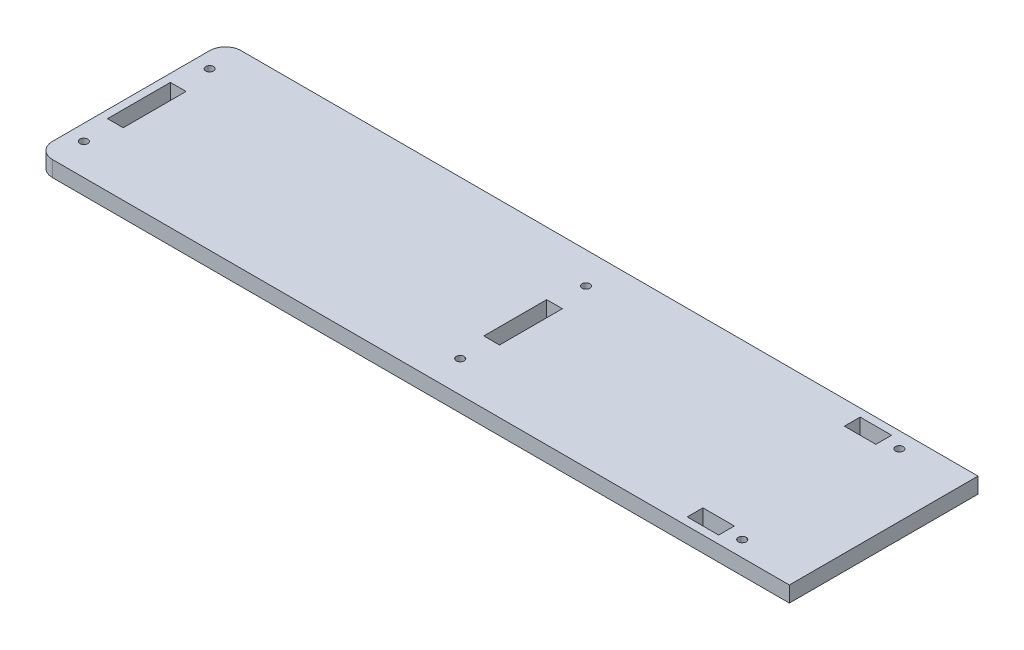
ISO-10303-21;
HEADER;
FILE_DESCRIPTION(('STEP AP214'),'2;1');
FILE_NAME('part.step','',(''),(''),'','','');
FILE_SCHEMA(('AUTOMOTIVE_DESIGN { 1 0 10303 214 1 1 1 1 }'));
ENDSEC;
DATA;
#1=APPLICATION_CONTEXT('core data for automotive mechanical design processes');
#2=APPLICATION_PROTOCOL_DEFINITION('international standard','automotive_design',2000,#1);
#3=PRODUCT_CONTEXT('',#1,'mechanical');
#4=PRODUCT('Part','Part','',(#3));
#5=PRODUCT_RELATED_PRODUCT_CATEGORY('part','',(#4));
#6=PRODUCT_DEFINITION_FORMATION('','',#4);
#7=PRODUCT_DEFINITION_CONTEXT('part definition',#1,'design');
#8=PRODUCT_DEFINITION('design','',#6,#7);
#9=PRODUCT_DEFINITION_SHAPE('','',#8);
#10=(LENGTH_UNIT() NAMED_UNIT(*) SI_UNIT(.MILLI.,.METRE.));
#11=(NAMED_UNIT(*) PLANE_ANGLE_UNIT() SI_UNIT($,.RADIAN.));
#12=(NAMED_UNIT(*) SI_UNIT($,.STERADIAN.) SOLID_ANGLE_UNIT());
#13=UNCERTAINTY_MEASURE_WITH_UNIT(LENGTH_MEASURE(1.E-05),#10,'distance_accuracy_value','');
#14=(GEOMETRIC_REPRESENTATION_CONTEXT(3) GLOBAL_UNCERTAINTY_ASSIGNED_CONTEXT((#13)) GLOBAL_UNIT_ASSIGNED_CONTEXT((#10,
#11,#12)) REPRESENTATION_CONTEXT('',''));
#15=CARTESIAN_POINT('',(0.,0.,0.));
#16=DIRECTION('',(0.,0.,1.));
#17=DIRECTION('',(1.,0.,0.));
#18=AXIS2_PLACEMENT_3D('',#15,#16,#17);
#19=CARTESIAN_POINT('',(-51.2350769381408,6.35,106.983409223297));
#20=DIRECTION('',(0.,1.,0.));
#21=DIRECTION('',(0.,0.,1.));
#22=AXIS2_PLACEMENT_3D('',#19,#20,#21);
#23=PLANE('',#22);
#24=DIRECTION('',(0.,0.,1.));
#25=VECTOR('',#24,1.);
#26=CARTESIAN_POINT('',(202.009341534766,6.35,103.808409223297));
#27=LINE('',#26,#25);
#28=CARTESIAN_POINT('',(202.009341534766,6.35,103.808409223297));
#29=VERTEX_POINT('',#28);
#30=CARTESIAN_POINT('',(202.009341534766,6.35,110.158409223297));
#31=VERTEX_POINT('',#30);
#32=EDGE_CURVE('E222',#29,#31,#27,.T.);
#33=ORIENTED_EDGE('',*,*,#32,.F.);
#34=DIRECTION('',(-1.,0.,0.));
#35=VECTOR('',#34,1.);
#36=CARTESIAN_POINT('',(214.709341534766,6.35,103.808409223297));
#37=LINE('',#36,#35);
#38=CARTESIAN_POINT('',(214.709341534766,6.35,103.808409223297));
#39=VERTEX_POINT('',#38);
#40=EDGE_CURVE('E220',#39,#29,#37,.T.);
#41=ORIENTED_EDGE('',*,*,#40,.F.);
#42=DIRECTION('',(0.,0.,-1.));
#43=VECTOR('',#42,1.);
#44=CARTESIAN_POINT('',(214.709341534766,6.35,110.158409223297));
#45=LINE('',#44,#43);
#46=CARTESIAN_POINT('',(214.709341534766,6.35,110.158409223297));
#47=VERTEX_POINT('',#46);
#48=EDGE_CURVE('E228',#47,#39,#45,.T.);
#49=ORIENTED_EDGE('',*,*,#48,.F.);
#50=DIRECTION('',(1.,0.,0.));
#51=VECTOR('',#50,1.);
#52=CARTESIAN_POINT('',(202.009341534766,6.35,110.158409223297));
#53=LINE('',#52,#51);
#54=EDGE_CURVE('E225',#31,#47,#53,.T.);
#55=ORIENTED_EDGE('',*,*,#54,.F.);
#56=EDGE_LOOP('',(#33,#41,#49,#55));
#57=FACE_BOUND('',#56,.T.);
#58=CARTESIAN_POINT('',(221.059341534766,6.35,106.983409223297));
#59=DIRECTION('',(0.,1.,0.));
#60=DIRECTION('',(0.,0.,1.));
#61=AXIS2_PLACEMENT_3D('',#58,#59,#60);
#62=CIRCLE('',#61,1.58749999999996);
#63=CARTESIAN_POINT('',(221.059341534766,6.35,108.570909223297));
#64=VERTEX_POINT('',#63);
#65=EDGE_CURVE('E249',#64,#64,#62,.T.);
#66=ORIENTED_EDGE('',*,*,#65,.F.);
#67=EDGE_LOOP('',(#66));
#68=FACE_BOUND('',#67,.T.);
#69=CARTESIAN_POINT('',(100.787132298313,6.35,100.633409223297));
#70=DIRECTION('',(0.,1.,0.));
#71=DIRECTION('',(0.,0.,1.));
#72=AXIS2_PLACEMENT_3D('',#69,#70,#71);
#73=CIRCLE('',#72,1.58749999999996);
#74=CARTESIAN_POINT('',(100.787132298313,6.35,102.220909223297));
#75=VERTEX_POINT('',#74);
#76=EDGE_CURVE('E261',#75,#75,#73,.T.);
#77=ORIENTED_EDGE('',*,*,#76,.F.);
#78=EDGE_LOOP('',(#77));
#79=FACE_BOUND('',#78,.T.);
#80=CARTESIAN_POINT('',(-51.2350769381408,6.35,100.633409223297));
#81=DIRECTION('',(0.,1.,0.));
#82=DIRECTION('',(0.,0.,1.));
#83=AXIS2_PLACEMENT_3D('',#80,#81,#82);
#84=CIRCLE('',#83,1.58750000000002);
#85=CARTESIAN_POINT('',(-51.2350769381408,6.35,102.220909223297));
#86=VERTEX_POINT('',#85);
#87=EDGE_CURVE('E302',#86,#86,#84,.T.);
#88=ORIENTED_EDGE('',*,*,#87,.F.);
#89=EDGE_LOOP('',(#88));
#90=FACE_BOUND('',#89,.T.);
#91=CARTESIAN_POINT('',(-51.2350769381408,6.35,106.983409223297));
#92=DIRECTION('',(0.,1.,0.));
#93=DIRECTION('',(0.,0.,1.));
#94=AXIS2_PLACEMENT_3D('',#91,#92,#93);
#95=CIRCLE('',#94,6.35000000000002);
#96=CARTESIAN_POINT('',(-57.5850769381407,6.35,106.983409223297));
#97=VERTEX_POINT('',#96);
#98=CARTESIAN_POINT('',(-51.2350769381408,6.35,113.333409223297));
#99=VERTEX_POINT('',#98);
#100=EDGE_CURVE('E337',#97,#99,#95,.T.);
#101=ORIENTED_EDGE('',*,*,#100,.T.);
#102=DIRECTION('',(1.,0.,0.));
#103=VECTOR('',#102,1.);
#104=CARTESIAN_POINT('',(-51.2350769381408,6.35,113.333409223297));
#105=LINE('',#104,#103);
#106=CARTESIAN_POINT('',(246.459341534766,6.35,113.333409223297));
#107=VERTEX_POINT('',#106);
#108=EDGE_CURVE('E340',#99,#107,#105,.T.);
#109=ORIENTED_EDGE('',*,*,#108,.T.);
#110=DIRECTION('',(0.,0.,-1.));
#111=VECTOR('',#110,1.);
#112=CARTESIAN_POINT('',(246.459341534766,6.35,37.133409223297));
#113=LINE('',#112,#111);
#114=CARTESIAN_POINT('',(246.459341534766,6.35,37.133409223297));
#115=VERTEX_POINT('',#114);
#116=EDGE_CURVE('E343',#107,#115,#113,.T.);
#117=ORIENTED_EDGE('',*,*,#116,.T.);
#118=DIRECTION('',(-1.,0.,0.));
#119=VECTOR('',#118,1.);
#120=CARTESIAN_POINT('',(-51.2350769381408,6.35,37.1334092232969));
#121=LINE('',#120,#119);
#122=CARTESIAN_POINT('',(-51.2350769381408,6.35,37.1334092232969));
#123=VERTEX_POINT('',#122);
#124=EDGE_CURVE('E345',#115,#123,#121,.T.);
#125=ORIENTED_EDGE('',*,*,#124,.T.);
#126=CARTESIAN_POINT('',(-51.2350769381408,6.35,43.483409223297));
#127=DIRECTION('',(0.,1.,0.));
#128=DIRECTION('',(0.,0.,1.));
#129=AXIS2_PLACEMENT_3D('',#126,#127,#128);
#130=CIRCLE('',#129,6.35000000000002);
#131=CARTESIAN_POINT('',(-57.5850769381408,6.35,43.483409223297));
#132=VERTEX_POINT('',#131);
#133=EDGE_CURVE('E347',#123,#132,#130,.T.);
#134=ORIENTED_EDGE('',*,*,#133,.T.);
#135=DIRECTION('',(0.,0.,1.));
#136=VECTOR('',#135,1.);
#137=CARTESIAN_POINT('',(-57.5850769381407,6.35,43.483409223297));
#138=LINE('',#137,#136);
#139=EDGE_CURVE('E349',#132,#97,#138,.T.);
#140=ORIENTED_EDGE('',*,*,#139,.T.);
#141=EDGE_LOOP('',(#101,#109,#117,#125,#134,#140));
#142=FACE_BOUND('',#141,.T.);
#143=DIRECTION('',(0.,0.,-1.));
#144=VECTOR('',#143,1.);
#145=CARTESIAN_POINT('',(-48.0600769381407,6.35,62.5334092232969));
#146=LINE('',#145,#144);
#147=CARTESIAN_POINT('',(-48.0600769381407,6.35,87.9334092232968));
#148=VERTEX_POINT('',#147);
#149=CARTESIAN_POINT('',(-48.0600769381407,6.35,62.5334092232969));
#150=VERTEX_POINT('',#149);
#151=EDGE_CURVE('E313',#148,#150,#146,.T.);
#152=ORIENTED_EDGE('',*,*,#151,.F.);
#153=DIRECTION('',(1.,0.,0.));
#154=VECTOR('',#153,1.);
#155=CARTESIAN_POINT('',(-48.0600769381407,6.35,87.9334092232968));
#156=LINE('',#155,#154);
#157=CARTESIAN_POINT('',(-54.4100769381406,6.35,87.9334092232968));
#158=VERTEX_POINT('',#157);
#159=EDGE_CURVE('E310',#158,#148,#156,.T.);
#160=ORIENTED_EDGE('',*,*,#159,.F.);
#161=DIRECTION('',(0.,0.,1.));
#162=VECTOR('',#161,1.);
#163=CARTESIAN_POINT('',(-54.4100769381406,6.35,87.9334092232968));
#164=LINE('',#163,#162);
#165=CARTESIAN_POINT('',(-54.4100769381408,6.35,62.5334092232969));
#166=VERTEX_POINT('',#165);
#167=EDGE_CURVE('E308',#166,#158,#164,.T.);
#168=ORIENTED_EDGE('',*,*,#167,.F.);
#169=DIRECTION('',(-1.,0.,0.));
#170=VECTOR('',#169,1.);
#171=CARTESIAN_POINT('',(-54.4100769381408,6.35,62.5334092232969));
#172=LINE('',#171,#170);
#173=EDGE_CURVE('E315',#150,#166,#172,.T.);
#174=ORIENTED_EDGE('',*,*,#173,.F.);
#175=EDGE_LOOP('',(#152,#160,#168,#174));
#176=FACE_BOUND('',#175,.T.);
#177=CARTESIAN_POINT('',(-51.2350769381408,6.35,49.8334092232968));
#178=DIRECTION('',(0.,1.,0.));
#179=DIRECTION('',(0.,0.,1.));
#180=AXIS2_PLACEMENT_3D('',#177,#178,#179);
#181=CIRCLE('',#180,1.58750000000002);
#182=CARTESIAN_POINT('',(-51.2350769381408,6.35,51.4209092232968));
#183=VERTEX_POINT('',#182);
#184=EDGE_CURVE('E296',#183,#183,#181,.T.);
#185=ORIENTED_EDGE('',*,*,#184,.F.);
#186=EDGE_LOOP('',(#185));
#187=FACE_BOUND('',#186,.T.);
#188=DIRECTION('',(0.,0.,-1.));
#189=VECTOR('',#188,1.);
#190=CARTESIAN_POINT('',(103.962132298313,6.35,62.533409223297));
#191=LINE('',#190,#189);
#192=CARTESIAN_POINT('',(103.962132298313,6.35,87.9334092232969));
#193=VERTEX_POINT('',#192);
#194=CARTESIAN_POINT('',(103.962132298313,6.35,62.533409223297));
#195=VERTEX_POINT('',#194);
#196=EDGE_CURVE('E272',#193,#195,#191,.T.);
#197=ORIENTED_EDGE('',*,*,#196,.F.);
#198=DIRECTION('',(1.,0.,0.));
#199=VECTOR('',#198,1.);
#200=CARTESIAN_POINT('',(103.962132298313,6.35,87.9334092232969));
#201=LINE('',#200,#199);
#202=CARTESIAN_POINT('',(97.6121322983129,6.35,87.9334092232969));
#203=VERTEX_POINT('',#202);
#204=EDGE_CURVE('E269',#203,#193,#201,.T.);
#205=ORIENTED_EDGE('',*,*,#204,.F.);
#206=DIRECTION('',(0.,0.,1.));
#207=VECTOR('',#206,1.);
#208=CARTESIAN_POINT('',(97.6121322983129,6.35,87.9334092232969));
#209=LINE('',#208,#207);
#210=CARTESIAN_POINT('',(97.6121322983128,6.35,62.533409223297));
#211=VERTEX_POINT('',#210);
#212=EDGE_CURVE('E267',#211,#203,#209,.T.);
#213=ORIENTED_EDGE('',*,*,#212,.F.);
#214=DIRECTION('',(-1.,0.,0.));
#215=VECTOR('',#214,1.);
#216=CARTESIAN_POINT('',(97.6121322983128,6.35,62.533409223297));
#217=LINE('',#216,#215);
#218=EDGE_CURVE('E274',#195,#211,#217,.T.);
#219=ORIENTED_EDGE('',*,*,#218,.F.);
#220=EDGE_LOOP('',(#197,#205,#213,#219));
#221=FACE_BOUND('',#220,.T.);
#222=CARTESIAN_POINT('',(100.787132298313,6.35,49.8334092232969));
#223=DIRECTION('',(0.,1.,0.));
#224=DIRECTION('',(0.,0.,1.));
#225=AXIS2_PLACEMENT_3D('',#222,#223,#224);
#226=CIRCLE('',#225,1.58749999999996);
#227=CARTESIAN_POINT('',(100.787132298313,6.35,51.4209092232969));
#228=VERTEX_POINT('',#227);
#229=EDGE_CURVE('E255',#228,#228,#226,.T.);
#230=ORIENTED_EDGE('',*,*,#229,.F.);
#231=EDGE_LOOP('',(#230));
#232=FACE_BOUND('',#231,.T.);
#233=CARTESIAN_POINT('',(221.059341534766,6.35,43.4834092232971));
#234=DIRECTION('',(0.,1.,0.));
#235=DIRECTION('',(0.,0.,1.));
#236=AXIS2_PLACEMENT_3D('',#233,#234,#235);
#237=CIRCLE('',#236,1.58749999999996);
#238=CARTESIAN_POINT('',(221.059341534766,6.35,45.070909223297));
#239=VERTEX_POINT('',#238);
#240=EDGE_CURVE('E214',#239,#239,#237,.T.);
#241=ORIENTED_EDGE('',*,*,#240,.F.);
#242=EDGE_LOOP('',(#241));
#243=FACE_BOUND('',#242,.T.);
#244=DIRECTION('',(-1.,0.,0.));
#245=VECTOR('',#244,1.);
#246=CARTESIAN_POINT('',(202.009341534766,6.35,40.308409223297));
#247=LINE('',#246,#245);
#248=CARTESIAN_POINT('',(214.709341534766,6.35,40.308409223297));
#249=VERTEX_POINT('',#248);
#250=CARTESIAN_POINT('',(202.009341534766,6.35,40.308409223297));
#251=VERTEX_POINT('',#250);
#252=EDGE_CURVE('E196',#249,#251,#247,.T.);
#253=ORIENTED_EDGE('',*,*,#252,.F.);
#254=DIRECTION('',(0.,0.,-1.));
#255=VECTOR('',#254,1.);
#256=CARTESIAN_POINT('',(214.709341534766,6.35,40.308409223297));
#257=LINE('',#256,#255);
#258=CARTESIAN_POINT('',(214.709341534766,6.35,46.658409223297));
#259=VERTEX_POINT('',#258);
#260=EDGE_CURVE('E183',#259,#249,#257,.T.);
#261=ORIENTED_EDGE('',*,*,#260,.F.);
#262=DIRECTION('',(1.,0.,0.));
#263=VECTOR('',#262,1.);
#264=CARTESIAN_POINT('',(214.709341534766,6.35,46.658409223297));
#265=LINE('',#264,#263);
#266=CARTESIAN_POINT('',(202.009341534766,6.35,46.658409223297));
#267=VERTEX_POINT('',#266);
#268=EDGE_CURVE('E178',#267,#259,#265,.T.);
#269=ORIENTED_EDGE('',*,*,#268,.F.);
#270=DIRECTION('',(0.,0.,1.));
#271=VECTOR('',#270,1.);
#272=CARTESIAN_POINT('',(202.009341534766,6.35,46.658409223297));
#273=LINE('',#272,#271);
#274=EDGE_CURVE('E198',#251,#267,#273,.T.);
#275=ORIENTED_EDGE('',*,*,#274,.F.);
#276=EDGE_LOOP('',(#253,#261,#269,#275));
#277=FACE_BOUND('',#276,.T.);
#278=ADVANCED_FACE('F32',(#57,#68,#79,#90,#142,#176,#187,#221,#232,#243,#277),#23,.T.);
#279=CARTESIAN_POINT('',(-51.2350769381408,0.,106.983409223297));
#280=DIRECTION('',(0.,1.,0.));
#281=DIRECTION('',(0.,0.,1.));
#282=AXIS2_PLACEMENT_3D('',#279,#280,#281);
#283=PLANE('',#282);
#284=CARTESIAN_POINT('',(221.059341534766,0.,43.4834092232971));
#285=DIRECTION('',(0.,1.,0.));
#286=DIRECTION('',(0.,0.,1.));
#287=AXIS2_PLACEMENT_3D('',#284,#285,#286);
#288=CIRCLE('',#287,1.58749999999996);
#289=CARTESIAN_POINT('',(221.059341534766,0.,45.070909223297));
#290=VERTEX_POINT('',#289);
#291=EDGE_CURVE('E192',#290,#290,#288,.T.);
#292=ORIENTED_EDGE('',*,*,#291,.T.);
#293=EDGE_LOOP('',(#292));
#294=FACE_BOUND('',#293,.T.);
#295=DIRECTION('',(-1.,0.,0.));
#296=VECTOR('',#295,1.);
#297=CARTESIAN_POINT('',(208.359341534766,0.,103.808409223297));
#298=LINE('',#297,#296);
#299=CARTESIAN_POINT('',(214.709341534766,0.,103.808409223297));
#300=VERTEX_POINT('',#299);
#301=CARTESIAN_POINT('',(202.009341534766,0.,103.808409223297));
#302=VERTEX_POINT('',#301);
#303=EDGE_CURVE('E217',#300,#302,#298,.T.);
#304=ORIENTED_EDGE('',*,*,#303,.T.);
#305=DIRECTION('',(0.,0.,1.));
#306=VECTOR('',#305,1.);
#307=CARTESIAN_POINT('',(202.009341534766,0.,103.808409223297));
#308=LINE('',#307,#306);
#309=CARTESIAN_POINT('',(202.009341534766,0.,110.158409223297));
#310=VERTEX_POINT('',#309);
#311=EDGE_CURVE('E233',#302,#310,#308,.T.);
#312=ORIENTED_EDGE('',*,*,#311,.T.);
#313=DIRECTION('',(1.,0.,0.));
#314=VECTOR('',#313,1.);
#315=CARTESIAN_POINT('',(202.009341534766,0.,110.158409223297));
#316=LINE('',#315,#314);
#317=CARTESIAN_POINT('',(214.709341534766,0.,110.158409223297));
#318=VERTEX_POINT('',#317);
#319=EDGE_CURVE('E236',#310,#318,#316,.T.);
#320=ORIENTED_EDGE('',*,*,#319,.T.);
#321=DIRECTION('',(0.,0.,-1.));
#322=VECTOR('',#321,1.);
#323=CARTESIAN_POINT('',(214.709341534766,0.,110.158409223297));
#324=LINE('',#323,#322);
#325=EDGE_CURVE('E223',#318,#300,#324,.T.);
#326=ORIENTED_EDGE('',*,*,#325,.T.);
#327=EDGE_LOOP('',(#304,#312,#320,#326));
#328=FACE_BOUND('',#327,.T.);
#329=CARTESIAN_POINT('',(-51.2350769381408,0.,49.8334092232968));
#330=DIRECTION('',(0.,1.,0.));
#331=DIRECTION('',(0.,0.,1.));
#332=AXIS2_PLACEMENT_3D('',#329,#330,#331);
#333=CIRCLE('',#332,1.58750000000002);
#334=CARTESIAN_POINT('',(-51.2350769381408,0.,51.4209092232968));
#335=VERTEX_POINT('',#334);
#336=EDGE_CURVE('E295',#335,#335,#333,.T.);
#337=ORIENTED_EDGE('',*,*,#336,.T.);
#338=EDGE_LOOP('',(#337));
#339=FACE_BOUND('',#338,.T.);
#340=CARTESIAN_POINT('',(-51.2350769381408,0.,100.633409223297));
#341=DIRECTION('',(0.,1.,0.));
#342=DIRECTION('',(0.,0.,1.));
#343=AXIS2_PLACEMENT_3D('',#340,#341,#342);
#344=CIRCLE('',#343,1.58750000000002);
#345=CARTESIAN_POINT('',(-51.2350769381408,0.,102.220909223297));
#346=VERTEX_POINT('',#345);
#347=EDGE_CURVE('E299',#346,#346,#344,.T.);
#348=ORIENTED_EDGE('',*,*,#347,.T.);
#349=EDGE_LOOP('',(#348));
#350=FACE_BOUND('',#349,.T.);
#351=DIRECTION('',(1.,0.,0.));
#352=VECTOR('',#351,1.);
#353=CARTESIAN_POINT('',(-48.0600769381407,0.,87.9334092232968));
#354=LINE('',#353,#352);
#355=CARTESIAN_POINT('',(-54.4100769381408,0.,87.9334092232968));
#356=VERTEX_POINT('',#355);
#357=CARTESIAN_POINT('',(-48.0600769381407,0.,87.9334092232968));
#358=VERTEX_POINT('',#357);
#359=EDGE_CURVE('E305',#356,#358,#354,.T.);
#360=ORIENTED_EDGE('',*,*,#359,.T.);
#361=DIRECTION('',(0.,0.,-1.));
#362=VECTOR('',#361,1.);
#363=CARTESIAN_POINT('',(-48.0600769381407,0.,62.5334092232969));
#364=LINE('',#363,#362);
#365=CARTESIAN_POINT('',(-48.0600769381407,0.,62.5334092232969));
#366=VERTEX_POINT('',#365);
#367=EDGE_CURVE('E321',#358,#366,#364,.T.);
#368=ORIENTED_EDGE('',*,*,#367,.T.);
#369=DIRECTION('',(-1.,0.,0.));
#370=VECTOR('',#369,1.);
#371=CARTESIAN_POINT('',(-54.4100769381408,0.,62.5334092232969));
#372=LINE('',#371,#370);
#373=CARTESIAN_POINT('',(-54.4100769381408,0.,62.5334092232969));
#374=VERTEX_POINT('',#373);
#375=EDGE_CURVE('E324',#366,#374,#372,.T.);
#376=ORIENTED_EDGE('',*,*,#375,.T.);
#377=DIRECTION('',(0.,0.,1.));
#378=VECTOR('',#377,1.);
#379=CARTESIAN_POINT('',(-54.4100769381408,0.,75.2334092232968));
#380=LINE('',#379,#378);
#381=EDGE_CURVE('E311',#374,#356,#380,.T.);
#382=ORIENTED_EDGE('',*,*,#381,.T.);
#383=EDGE_LOOP('',(#360,#368,#376,#382));
#384=FACE_BOUND('',#383,.T.);
#385=CARTESIAN_POINT('',(-51.2350769381408,0.,106.983409223297));
#386=DIRECTION('',(0.,1.,0.));
#387=DIRECTION('',(0.,0.,1.));
#388=AXIS2_PLACEMENT_3D('',#385,#386,#387);
#389=CIRCLE('',#388,6.35000000000002);
#390=CARTESIAN_POINT('',(-57.5850769381407,0.,106.983409223297));
#391=VERTEX_POINT('',#390);
#392=CARTESIAN_POINT('',(-51.2350769381408,0.,113.333409223297));
#393=VERTEX_POINT('',#392);
#394=EDGE_CURVE('E336',#391,#393,#389,.T.);
#395=ORIENTED_EDGE('',*,*,#394,.F.);
#396=DIRECTION('',(0.,0.,1.));
#397=VECTOR('',#396,1.);
#398=CARTESIAN_POINT('',(-57.5850769381407,0.,43.483409223297));
#399=LINE('',#398,#397);
#400=CARTESIAN_POINT('',(-57.5850769381408,0.,43.483409223297));
#401=VERTEX_POINT('',#400);
#402=EDGE_CURVE('E341',#401,#391,#399,.T.);
#403=ORIENTED_EDGE('',*,*,#402,.F.);
#404=CARTESIAN_POINT('',(-51.2350769381408,0.,43.483409223297));
#405=DIRECTION('',(0.,1.,0.));
#406=DIRECTION('',(0.,0.,1.));
#407=AXIS2_PLACEMENT_3D('',#404,#405,#406);
#408=CIRCLE('',#407,6.35000000000002);
#409=CARTESIAN_POINT('',(-51.2350769381408,0.,37.1334092232969));
#410=VERTEX_POINT('',#409);
#411=EDGE_CURVE('E360',#410,#401,#408,.T.);
#412=ORIENTED_EDGE('',*,*,#411,.F.);
#413=DIRECTION('',(-1.,0.,0.));
#414=VECTOR('',#413,1.);
#415=CARTESIAN_POINT('',(-51.2350769381408,0.,37.1334092232969));
#416=LINE('',#415,#414);
#417=CARTESIAN_POINT('',(246.459341534766,0.,37.133409223297));
#418=VERTEX_POINT('',#417);
#419=EDGE_CURVE('E358',#418,#410,#416,.T.);
#420=ORIENTED_EDGE('',*,*,#419,.F.);
#421=DIRECTION('',(0.,0.,-1.));
#422=VECTOR('',#421,1.);
#423=CARTESIAN_POINT('',(246.459341534766,0.,37.133409223297));
#424=LINE('',#423,#422);
#425=CARTESIAN_POINT('',(246.459341534766,0.,113.333409223297));
#426=VERTEX_POINT('',#425);
#427=EDGE_CURVE('E356',#426,#418,#424,.T.);
#428=ORIENTED_EDGE('',*,*,#427,.F.);
#429=DIRECTION('',(1.,0.,0.));
#430=VECTOR('',#429,1.);
#431=CARTESIAN_POINT('',(-51.2350769381408,0.,113.333409223297));
#432=LINE('',#431,#430);
#433=EDGE_CURVE('E354',#393,#426,#432,.T.);
#434=ORIENTED_EDGE('',*,*,#433,.F.);
#435=EDGE_LOOP('',(#395,#403,#412,#420,#428,#434));
#436=FACE_BOUND('',#435,.T.);
#437=DIRECTION('',(1.,0.,0.));
#438=VECTOR('',#437,1.);
#439=CARTESIAN_POINT('',(103.962132298313,0.,87.9334092232969));
#440=LINE('',#439,#438);
#441=CARTESIAN_POINT('',(97.6121322983128,0.,87.9334092232969));
#442=VERTEX_POINT('',#441);
#443=CARTESIAN_POINT('',(103.962132298313,0.,87.9334092232969));
#444=VERTEX_POINT('',#443);
#445=EDGE_CURVE('E264',#442,#444,#440,.T.);
#446=ORIENTED_EDGE('',*,*,#445,.T.);
#447=DIRECTION('',(0.,0.,-1.));
#448=VECTOR('',#447,1.);
#449=CARTESIAN_POINT('',(103.962132298313,0.,62.533409223297));
#450=LINE('',#449,#448);
#451=CARTESIAN_POINT('',(103.962132298313,0.,62.533409223297));
#452=VERTEX_POINT('',#451);
#453=EDGE_CURVE('E280',#444,#452,#450,.T.);
#454=ORIENTED_EDGE('',*,*,#453,.T.);
#455=DIRECTION('',(-1.,0.,0.));
#456=VECTOR('',#455,1.);
#457=CARTESIAN_POINT('',(97.6121322983128,0.,62.533409223297));
#458=LINE('',#457,#456);
#459=CARTESIAN_POINT('',(97.6121322983128,0.,62.533409223297));
#460=VERTEX_POINT('',#459);
#461=EDGE_CURVE('E283',#452,#460,#458,.T.);
#462=ORIENTED_EDGE('',*,*,#461,.T.);
#463=DIRECTION('',(0.,0.,1.));
#464=VECTOR('',#463,1.);
#465=CARTESIAN_POINT('',(97.6121322983128,0.,75.2334092232969));
#466=LINE('',#465,#464);
#467=EDGE_CURVE('E270',#460,#442,#466,.T.);
#468=ORIENTED_EDGE('',*,*,#467,.T.);
#469=EDGE_LOOP('',(#446,#454,#462,#468));
#470=FACE_BOUND('',#469,.T.);
#471=CARTESIAN_POINT('',(100.787132298313,0.,100.633409223297));
#472=DIRECTION('',(0.,1.,0.));
#473=DIRECTION('',(0.,0.,1.));
#474=AXIS2_PLACEMENT_3D('',#471,#472,#473);
#475=CIRCLE('',#474,1.58749999999996);
#476=CARTESIAN_POINT('',(100.787132298313,0.,102.220909223297));
#477=VERTEX_POINT('',#476);
#478=EDGE_CURVE('E258',#477,#477,#475,.T.);
#479=ORIENTED_EDGE('',*,*,#478,.T.);
#480=EDGE_LOOP('',(#479));
#481=FACE_BOUND('',#480,.T.);
#482=CARTESIAN_POINT('',(100.787132298313,0.,49.8334092232969));
#483=DIRECTION('',(0.,1.,0.));
#484=DIRECTION('',(0.,0.,1.));
#485=AXIS2_PLACEMENT_3D('',#482,#483,#484);
#486=CIRCLE('',#485,1.58749999999996);
#487=CARTESIAN_POINT('',(100.787132298313,0.,51.4209092232969));
#488=VERTEX_POINT('',#487);
#489=EDGE_CURVE('E252',#488,#488,#486,.T.);
#490=ORIENTED_EDGE('',*,*,#489,.T.);
#491=EDGE_LOOP('',(#490));
#492=FACE_BOUND('',#491,.T.);
#493=CARTESIAN_POINT('',(221.059341534766,0.,106.983409223297));
#494=DIRECTION('',(0.,1.,0.));
#495=DIRECTION('',(0.,0.,1.));
#496=AXIS2_PLACEMENT_3D('',#493,#494,#495);
#497=CIRCLE('',#496,1.58749999999996);
#498=CARTESIAN_POINT('',(221.059341534766,0.,108.570909223297));
#499=VERTEX_POINT('',#498);
#500=EDGE_CURVE('E248',#499,#499,#497,.T.);
#501=ORIENTED_EDGE('',*,*,#500,.T.);
#502=EDGE_LOOP('',(#501));
#503=FACE_BOUND('',#502,.T.);
#504=DIRECTION('',(0.,0.,-1.));
#505=VECTOR('',#504,1.);
#506=CARTESIAN_POINT('',(214.709341534766,0.,40.308409223297));
#507=LINE('',#506,#505);
#508=CARTESIAN_POINT('',(214.709341534766,0.,46.658409223297));
#509=VERTEX_POINT('',#508);
#510=CARTESIAN_POINT('',(214.709341534766,0.,40.308409223297));
#511=VERTEX_POINT('',#510);
#512=EDGE_CURVE('E190',#509,#511,#507,.T.);
#513=ORIENTED_EDGE('',*,*,#512,.T.);
#514=DIRECTION('',(-1.,0.,0.));
#515=VECTOR('',#514,1.);
#516=CARTESIAN_POINT('',(202.009341534766,0.,40.308409223297));
#517=LINE('',#516,#515);
#518=CARTESIAN_POINT('',(202.009341534766,0.,40.308409223297));
#519=VERTEX_POINT('',#518);
#520=EDGE_CURVE('E203',#511,#519,#517,.T.);
#521=ORIENTED_EDGE('',*,*,#520,.T.);
#522=DIRECTION('',(0.,0.,1.));
#523=VECTOR('',#522,1.);
#524=CARTESIAN_POINT('',(202.009341534766,0.,46.658409223297));
#525=LINE('',#524,#523);
#526=CARTESIAN_POINT('',(202.009341534766,0.,46.658409223297));
#527=VERTEX_POINT('',#526);
#528=EDGE_CURVE('E206',#519,#527,#525,.T.);
#529=ORIENTED_EDGE('',*,*,#528,.T.);
#530=DIRECTION('',(1.,0.,0.));
#531=VECTOR('',#530,1.);
#532=CARTESIAN_POINT('',(208.359341534766,0.,46.658409223297));
#533=LINE('',#532,#531);
#534=EDGE_CURVE('E184',#527,#509,#533,.T.);
#535=ORIENTED_EDGE('',*,*,#534,.T.);
#536=EDGE_LOOP('',(#513,#521,#529,#535));
#537=FACE_BOUND('',#536,.T.);
#538=ADVANCED_FACE('F384',(#294,#328,#339,#350,#384,#436,#470,#481,#492,#503,#537),#283,.F.);
#539=CARTESIAN_POINT('',(-51.2350769381408,6.35,106.983409223297));
#540=DIRECTION('',(0.,-1.,0.));
#541=DIRECTION('',(0.,0.,-1.));
#542=AXIS2_PLACEMENT_3D('',#539,#540,#541);
#543=CYLINDRICAL_SURFACE('',#542,6.35000000000002);
#544=ORIENTED_EDGE('',*,*,#394,.T.);
#545=DIRECTION('',(0.,-1.,0.));
#546=VECTOR('',#545,1.);
#547=CARTESIAN_POINT('',(-51.2350769381408,6.35,113.333409223297));
#548=LINE('',#547,#546);
#549=EDGE_CURVE('E11',#99,#393,#548,.T.);
#550=ORIENTED_EDGE('',*,*,#549,.F.);
#551=ORIENTED_EDGE('',*,*,#100,.F.);
#552=DIRECTION('',(0.,-1.,0.));
#553=VECTOR('',#552,1.);
#554=CARTESIAN_POINT('',(-57.5850769381407,6.35,106.983409223297));
#555=LINE('',#554,#553);
#556=EDGE_CURVE('E351',#97,#391,#555,.T.);
#557=ORIENTED_EDGE('',*,*,#556,.T.);
#558=EDGE_LOOP('',(#544,#550,#551,#557));
#559=FACE_BOUND('',#558,.T.);
#560=ADVANCED_FACE('F34',(#559),#543,.T.);
#561=CARTESIAN_POINT('',(-51.2350769381408,6.35,113.333409223297));
#562=DIRECTION('',(0.,0.,-1.));
#563=DIRECTION('',(-1.,0.,0.));
#564=AXIS2_PLACEMENT_3D('',#561,#562,#563);
#565=PLANE('',#564);
#566=ORIENTED_EDGE('',*,*,#433,.T.);
#567=DIRECTION('',(0.,-1.,0.));
#568=VECTOR('',#567,1.);
#569=CARTESIAN_POINT('',(246.459341534766,6.35,113.333409223297));
#570=LINE('',#569,#568);
#571=EDGE_CURVE('E40',#107,#426,#570,.T.);
#572=ORIENTED_EDGE('',*,*,#571,.F.);
#573=ORIENTED_EDGE('',*,*,#108,.F.);
#574=ORIENTED_EDGE('',*,*,#549,.T.);
#575=EDGE_LOOP('',(#566,#572,#573,#574));
#576=FACE_BOUND('',#575,.T.);
#577=ADVANCED_FACE('F402',(#576),#565,.F.);
#578=CARTESIAN_POINT('',(246.459341534766,6.35,37.133409223297));
#579=DIRECTION('',(-1.,0.,0.));
#580=DIRECTION('',(0.,0.,1.));
#581=AXIS2_PLACEMENT_3D('',#578,#579,#580);
#582=PLANE('',#581);
#583=ORIENTED_EDGE('',*,*,#427,.T.);
#584=DIRECTION('',(0.,-1.,0.));
#585=VECTOR('',#584,1.);
#586=CARTESIAN_POINT('',(246.459341534766,6.35,37.133409223297));
#587=LINE('',#586,#585);
#588=EDGE_CURVE('E371',#115,#418,#587,.T.);
#589=ORIENTED_EDGE('',*,*,#588,.F.);
#590=ORIENTED_EDGE('',*,*,#116,.F.);
#591=ORIENTED_EDGE('',*,*,#571,.T.);
#592=EDGE_LOOP('',(#583,#589,#590,#591));
#593=FACE_BOUND('',#592,.T.);
#594=ADVANCED_FACE('F378',(#593),#582,.F.);
#595=CARTESIAN_POINT('',(-51.2350769381408,6.35,37.1334092232969));
#596=DIRECTION('',(0.,0.,1.));
#597=DIRECTION('',(1.,0.,0.));
#598=AXIS2_PLACEMENT_3D('',#595,#596,#597);
#599=PLANE('',#598);
#600=ORIENTED_EDGE('',*,*,#419,.T.);
#601=DIRECTION('',(0.,-1.,0.));
#602=VECTOR('',#601,1.);
#603=CARTESIAN_POINT('',(-51.2350769381408,6.35,37.1334092232969));
#604=LINE('',#603,#602);
#605=EDGE_CURVE('E368',#123,#410,#604,.T.);
#606=ORIENTED_EDGE('',*,*,#605,.F.);
#607=ORIENTED_EDGE('',*,*,#124,.F.);
#608=ORIENTED_EDGE('',*,*,#588,.T.);
#609=EDGE_LOOP('',(#600,#606,#607,#608));
#610=FACE_BOUND('',#609,.T.);
#611=ADVANCED_FACE('F390',(#610),#599,.F.);
#612=CARTESIAN_POINT('',(-51.2350769381408,6.35,43.483409223297));
#613=DIRECTION('',(0.,-1.,0.));
#614=DIRECTION('',(0.,0.,-1.));
#615=AXIS2_PLACEMENT_3D('',#612,#613,#614);
#616=CYLINDRICAL_SURFACE('',#615,6.35000000000002);
#617=ORIENTED_EDGE('',*,*,#411,.T.);
#618=DIRECTION('',(0.,-1.,0.));
#619=VECTOR('',#618,1.);
#620=CARTESIAN_POINT('',(-57.5850769381408,6.35,43.483409223297));
#621=LINE('',#620,#619);
#622=EDGE_CURVE('E365',#132,#401,#621,.T.);
#623=ORIENTED_EDGE('',*,*,#622,.F.);
#624=ORIENTED_EDGE('',*,*,#133,.F.);
#625=ORIENTED_EDGE('',*,*,#605,.T.);
#626=EDGE_LOOP('',(#617,#623,#624,#625));
#627=FACE_BOUND('',#626,.T.);
#628=ADVANCED_FACE('F394',(#627),#616,.T.);
#629=CARTESIAN_POINT('',(-57.5850769381407,6.35,43.483409223297));
#630=DIRECTION('',(1.,0.,0.));
#631=DIRECTION('',(0.,0.,-1.));
#632=AXIS2_PLACEMENT_3D('',#629,#630,#631);
#633=PLANE('',#632);
#634=ORIENTED_EDGE('',*,*,#402,.T.);
#635=ORIENTED_EDGE('',*,*,#556,.F.);
#636=ORIENTED_EDGE('',*,*,#139,.F.);
#637=ORIENTED_EDGE('',*,*,#622,.T.);
#638=EDGE_LOOP('',(#634,#635,#636,#637));
#639=FACE_BOUND('',#638,.T.);
#640=ADVANCED_FACE('F405',(#639),#633,.F.);
#641=CARTESIAN_POINT('',(-48.0600769381407,6.35,87.9334092232968));
#642=DIRECTION('',(0.,0.,-1.));
#643=DIRECTION('',(-1.,0.,0.));
#644=AXIS2_PLACEMENT_3D('',#641,#642,#643);
#645=PLANE('',#644);
#646=ORIENTED_EDGE('',*,*,#359,.F.);
#647=DIRECTION('',(0.,-1.,0.));
#648=VECTOR('',#647,1.);
#649=CARTESIAN_POINT('',(-54.4100769381406,6.35,87.9334092232968));
#650=LINE('',#649,#648);
#651=EDGE_CURVE('E334',#158,#356,#650,.T.);
#652=ORIENTED_EDGE('',*,*,#651,.F.);
#653=ORIENTED_EDGE('',*,*,#159,.T.);
#654=DIRECTION('',(0.,-1.,0.));
#655=VECTOR('',#654,1.);
#656=CARTESIAN_POINT('',(-48.0600769381407,6.35,87.9334092232968));
#657=LINE('',#656,#655);
#658=EDGE_CURVE('E332',#148,#358,#657,.T.);
#659=ORIENTED_EDGE('',*,*,#658,.T.);
#660=EDGE_LOOP('',(#646,#652,#653,#659));
#661=FACE_BOUND('',#660,.T.);
#662=ADVANCED_FACE('F407',(#661),#645,.T.);
#663=CARTESIAN_POINT('',(-48.0600769381407,6.35,62.5334092232969));
#664=DIRECTION('',(-1.,0.,0.));
#665=DIRECTION('',(0.,0.,1.));
#666=AXIS2_PLACEMENT_3D('',#663,#664,#665);
#667=PLANE('',#666);
#668=ORIENTED_EDGE('',*,*,#367,.F.);
#669=ORIENTED_EDGE('',*,*,#658,.F.);
#670=ORIENTED_EDGE('',*,*,#151,.T.);
#671=DIRECTION('',(0.,-1.,0.));
#672=VECTOR('',#671,1.);
#673=CARTESIAN_POINT('',(-48.0600769381407,6.35,62.5334092232969));
#674=LINE('',#673,#672);
#675=EDGE_CURVE('E330',#150,#366,#674,.T.);
#676=ORIENTED_EDGE('',*,*,#675,.T.);
#677=EDGE_LOOP('',(#668,#669,#670,#676));
#678=FACE_BOUND('',#677,.T.);
#679=ADVANCED_FACE('F413',(#678),#667,.T.);
#680=CARTESIAN_POINT('',(-54.4100769381408,6.35,62.5334092232969));
#681=DIRECTION('',(0.,0.,1.));
#682=DIRECTION('',(1.,0.,0.));
#683=AXIS2_PLACEMENT_3D('',#680,#681,#682);
#684=PLANE('',#683);
#685=ORIENTED_EDGE('',*,*,#375,.F.);
#686=ORIENTED_EDGE('',*,*,#675,.F.);
#687=ORIENTED_EDGE('',*,*,#173,.T.);
#688=DIRECTION('',(0.,-1.,0.));
#689=VECTOR('',#688,1.);
#690=CARTESIAN_POINT('',(-54.4100769381408,6.35,62.5334092232969));
#691=LINE('',#690,#689);
#692=EDGE_CURVE('E318',#166,#374,#691,.T.);
#693=ORIENTED_EDGE('',*,*,#692,.T.);
#694=EDGE_LOOP('',(#685,#686,#687,#693));
#695=FACE_BOUND('',#694,.T.);
#696=ADVANCED_FACE('F430',(#695),#684,.T.);
#697=CARTESIAN_POINT('',(-54.4100769381408,6.35,75.2334092232968));
#698=DIRECTION('',(1.,0.,0.));
#699=DIRECTION('',(0.,0.,-1.));
#700=AXIS2_PLACEMENT_3D('',#697,#698,#699);
#701=PLANE('',#700);
#702=ORIENTED_EDGE('',*,*,#381,.F.);
#703=ORIENTED_EDGE('',*,*,#692,.F.);
#704=ORIENTED_EDGE('',*,*,#167,.T.);
#705=ORIENTED_EDGE('',*,*,#651,.T.);
#706=EDGE_LOOP('',(#702,#703,#704,#705));
#707=FACE_BOUND('',#706,.T.);
#708=ADVANCED_FACE('F434',(#707),#701,.T.);
#709=CARTESIAN_POINT('',(-51.2350769381408,6.35,100.633409223297));
#710=DIRECTION('',(0.,-1.,0.));
#711=DIRECTION('',(0.,0.,-1.));
#712=AXIS2_PLACEMENT_3D('',#709,#710,#711);
#713=CYLINDRICAL_SURFACE('',#712,1.58750000000002);
#714=ORIENTED_EDGE('',*,*,#87,.T.);
#715=EDGE_LOOP('',(#714));
#716=FACE_BOUND('',#715,.T.);
#717=ORIENTED_EDGE('',*,*,#347,.F.);
#718=EDGE_LOOP('',(#717));
#719=FACE_BOUND('',#718,.T.);
#720=ADVANCED_FACE('F438',(#716,#719),#713,.F.);
#721=CARTESIAN_POINT('',(-51.2350769381408,6.35,49.8334092232968));
#722=DIRECTION('',(0.,-1.,0.));
#723=DIRECTION('',(0.,0.,-1.));
#724=AXIS2_PLACEMENT_3D('',#721,#722,#723);
#725=CYLINDRICAL_SURFACE('',#724,1.58750000000002);
#726=ORIENTED_EDGE('',*,*,#184,.T.);
#727=EDGE_LOOP('',(#726));
#728=FACE_BOUND('',#727,.T.);
#729=ORIENTED_EDGE('',*,*,#336,.F.);
#730=EDGE_LOOP('',(#729));
#731=FACE_BOUND('',#730,.T.);
#732=ADVANCED_FACE('F442',(#728,#731),#725,.F.);
#733=CARTESIAN_POINT('',(103.962132298313,6.35,87.9334092232969));
#734=DIRECTION('',(0.,0.,-1.));
#735=DIRECTION('',(-1.,0.,0.));
#736=AXIS2_PLACEMENT_3D('',#733,#734,#735);
#737=PLANE('',#736);
#738=ORIENTED_EDGE('',*,*,#445,.F.);
#739=DIRECTION('',(0.,-1.,0.));
#740=VECTOR('',#739,1.);
#741=CARTESIAN_POINT('',(97.6121322983129,6.35,87.9334092232969));
#742=LINE('',#741,#740);
#743=EDGE_CURVE('E293',#203,#442,#742,.T.);
#744=ORIENTED_EDGE('',*,*,#743,.F.);
#745=ORIENTED_EDGE('',*,*,#204,.T.);
#746=DIRECTION('',(0.,-1.,0.));
#747=VECTOR('',#746,1.);
#748=CARTESIAN_POINT('',(103.962132298313,6.35,87.9334092232969));
#749=LINE('',#748,#747);
#750=EDGE_CURVE('E291',#193,#444,#749,.T.);
#751=ORIENTED_EDGE('',*,*,#750,.T.);
#752=EDGE_LOOP('',(#738,#744,#745,#751));
#753=FACE_BOUND('',#752,.T.);
#754=ADVANCED_FACE('F446',(#753),#737,.T.);
#755=CARTESIAN_POINT('',(103.962132298313,6.35,62.533409223297));
#756=DIRECTION('',(-1.,0.,0.));
#757=DIRECTION('',(0.,0.,1.));
#758=AXIS2_PLACEMENT_3D('',#755,#756,#757);
#759=PLANE('',#758);
#760=ORIENTED_EDGE('',*,*,#453,.F.);
#761=ORIENTED_EDGE('',*,*,#750,.F.);
#762=ORIENTED_EDGE('',*,*,#196,.T.);
#763=DIRECTION('',(0.,-1.,0.));
#764=VECTOR('',#763,1.);
#765=CARTESIAN_POINT('',(103.962132298313,6.35,62.533409223297));
#766=LINE('',#765,#764);
#767=EDGE_CURVE('E289',#195,#452,#766,.T.);
#768=ORIENTED_EDGE('',*,*,#767,.T.);
#769=EDGE_LOOP('',(#760,#761,#762,#768));
#770=FACE_BOUND('',#769,.T.);
#771=ADVANCED_FACE('F450',(#770),#759,.T.);
#772=CARTESIAN_POINT('',(97.6121322983128,6.35,62.533409223297));
#773=DIRECTION('',(0.,0.,1.));
#774=DIRECTION('',(1.,0.,0.));
#775=AXIS2_PLACEMENT_3D('',#772,#773,#774);
#776=PLANE('',#775);
#777=ORIENTED_EDGE('',*,*,#461,.F.);
#778=ORIENTED_EDGE('',*,*,#767,.F.);
#779=ORIENTED_EDGE('',*,*,#218,.T.);
#780=DIRECTION('',(0.,-1.,0.));
#781=VECTOR('',#780,1.);
#782=CARTESIAN_POINT('',(97.6121322983128,6.35,62.533409223297));
#783=LINE('',#782,#781);
#784=EDGE_CURVE('E277',#211,#460,#783,.T.);
#785=ORIENTED_EDGE('',*,*,#784,.T.);
#786=EDGE_LOOP('',(#777,#778,#779,#785));
#787=FACE_BOUND('',#786,.T.);
#788=ADVANCED_FACE('F454',(#787),#776,.T.);
#789=CARTESIAN_POINT('',(97.6121322983128,6.35,75.2334092232969));
#790=DIRECTION('',(1.,0.,0.));
#791=DIRECTION('',(0.,0.,-1.));
#792=AXIS2_PLACEMENT_3D('',#789,#790,#791);
#793=PLANE('',#792);
#794=ORIENTED_EDGE('',*,*,#467,.F.);
#795=ORIENTED_EDGE('',*,*,#784,.F.);
#796=ORIENTED_EDGE('',*,*,#212,.T.);
#797=ORIENTED_EDGE('',*,*,#743,.T.);
#798=EDGE_LOOP('',(#794,#795,#796,#797));
#799=FACE_BOUND('',#798,.T.);
#800=ADVANCED_FACE('F458',(#799),#793,.T.);
#801=CARTESIAN_POINT('',(100.787132298313,6.35,100.633409223297));
#802=DIRECTION('',(0.,-1.,0.));
#803=DIRECTION('',(0.,0.,-1.));
#804=AXIS2_PLACEMENT_3D('',#801,#802,#803);
#805=CYLINDRICAL_SURFACE('',#804,1.58749999999996);
#806=ORIENTED_EDGE('',*,*,#76,.T.);
#807=EDGE_LOOP('',(#806));
#808=FACE_BOUND('',#807,.T.);
#809=ORIENTED_EDGE('',*,*,#478,.F.);
#810=EDGE_LOOP('',(#809));
#811=FACE_BOUND('',#810,.T.);
#812=ADVANCED_FACE('F462',(#808,#811),#805,.F.);
#813=CARTESIAN_POINT('',(100.787132298313,6.35,49.8334092232969));
#814=DIRECTION('',(0.,-1.,0.));
#815=DIRECTION('',(0.,0.,-1.));
#816=AXIS2_PLACEMENT_3D('',#813,#814,#815);
#817=CYLINDRICAL_SURFACE('',#816,1.58749999999996);
#818=ORIENTED_EDGE('',*,*,#229,.T.);
#819=EDGE_LOOP('',(#818));
#820=FACE_BOUND('',#819,.T.);
#821=ORIENTED_EDGE('',*,*,#489,.F.);
#822=EDGE_LOOP('',(#821));
#823=FACE_BOUND('',#822,.T.);
#824=ADVANCED_FACE('F466',(#820,#823),#817,.F.);
#825=CARTESIAN_POINT('',(221.059341534766,6.35,106.983409223297));
#826=DIRECTION('',(0.,-1.,0.));
#827=DIRECTION('',(0.,0.,-1.));
#828=AXIS2_PLACEMENT_3D('',#825,#826,#827);
#829=CYLINDRICAL_SURFACE('',#828,1.58749999999996);
#830=ORIENTED_EDGE('',*,*,#65,.T.);
#831=EDGE_LOOP('',(#830));
#832=FACE_BOUND('',#831,.T.);
#833=ORIENTED_EDGE('',*,*,#500,.F.);
#834=EDGE_LOOP('',(#833));
#835=FACE_BOUND('',#834,.T.);
#836=ADVANCED_FACE('F470',(#832,#835),#829,.F.);
#837=CARTESIAN_POINT('',(208.359341534766,6.35,103.808409223297));
#838=DIRECTION('',(0.,0.,1.));
#839=DIRECTION('',(1.,0.,0.));
#840=AXIS2_PLACEMENT_3D('',#837,#838,#839);
#841=PLANE('',#840);
#842=ORIENTED_EDGE('',*,*,#303,.F.);
#843=DIRECTION('',(0.,-1.,0.));
#844=VECTOR('',#843,1.);
#845=CARTESIAN_POINT('',(214.709341534766,6.35,103.808409223297));
#846=LINE('',#845,#844);
#847=EDGE_CURVE('E230',#39,#300,#846,.T.);
#848=ORIENTED_EDGE('',*,*,#847,.F.);
#849=ORIENTED_EDGE('',*,*,#40,.T.);
#850=DIRECTION('',(0.,-1.,0.));
#851=VECTOR('',#850,1.);
#852=CARTESIAN_POINT('',(202.009341534766,6.35,103.808409223297));
#853=LINE('',#852,#851);
#854=EDGE_CURVE('E246',#29,#302,#853,.T.);
#855=ORIENTED_EDGE('',*,*,#854,.T.);
#856=EDGE_LOOP('',(#842,#848,#849,#855));
#857=FACE_BOUND('',#856,.T.);
#858=ADVANCED_FACE('F474',(#857),#841,.T.);
#859=CARTESIAN_POINT('',(202.009341534766,6.35,103.808409223297));
#860=DIRECTION('',(1.,0.,0.));
#861=DIRECTION('',(0.,0.,-1.));
#862=AXIS2_PLACEMENT_3D('',#859,#860,#861);
#863=PLANE('',#862);
#864=ORIENTED_EDGE('',*,*,#311,.F.);
#865=ORIENTED_EDGE('',*,*,#854,.F.);
#866=ORIENTED_EDGE('',*,*,#32,.T.);
#867=DIRECTION('',(0.,-1.,0.));
#868=VECTOR('',#867,1.);
#869=CARTESIAN_POINT('',(202.009341534766,6.35,110.158409223297));
#870=LINE('',#869,#868);
#871=EDGE_CURVE('E244',#31,#310,#870,.T.);
#872=ORIENTED_EDGE('',*,*,#871,.T.);
#873=EDGE_LOOP('',(#864,#865,#866,#872));
#874=FACE_BOUND('',#873,.T.);
#875=ADVANCED_FACE('F478',(#874),#863,.T.);
#876=CARTESIAN_POINT('',(202.009341534766,6.35,110.158409223297));
#877=DIRECTION('',(0.,0.,-1.));
#878=DIRECTION('',(-1.,0.,0.));
#879=AXIS2_PLACEMENT_3D('',#876,#877,#878);
#880=PLANE('',#879);
#881=ORIENTED_EDGE('',*,*,#319,.F.);
#882=ORIENTED_EDGE('',*,*,#871,.F.);
#883=ORIENTED_EDGE('',*,*,#54,.T.);
#884=DIRECTION('',(0.,-1.,0.));
#885=VECTOR('',#884,1.);
#886=CARTESIAN_POINT('',(214.709341534766,6.35,110.158409223297));
#887=LINE('',#886,#885);
#888=EDGE_CURVE('E242',#47,#318,#887,.T.);
#889=ORIENTED_EDGE('',*,*,#888,.T.);
#890=EDGE_LOOP('',(#881,#882,#883,#889));
#891=FACE_BOUND('',#890,.T.);
#892=ADVANCED_FACE('F482',(#891),#880,.T.);
#893=CARTESIAN_POINT('',(214.709341534766,6.35,110.158409223297));
#894=DIRECTION('',(-1.,0.,0.));
#895=DIRECTION('',(0.,0.,1.));
#896=AXIS2_PLACEMENT_3D('',#893,#894,#895);
#897=PLANE('',#896);
#898=ORIENTED_EDGE('',*,*,#325,.F.);
#899=ORIENTED_EDGE('',*,*,#888,.F.);
#900=ORIENTED_EDGE('',*,*,#48,.T.);
#901=ORIENTED_EDGE('',*,*,#847,.T.);
#902=EDGE_LOOP('',(#898,#899,#900,#901));
#903=FACE_BOUND('',#902,.T.);
#904=ADVANCED_FACE('F486',(#903),#897,.T.);
#905=CARTESIAN_POINT('',(221.059341534766,6.35,43.4834092232971));
#906=DIRECTION('',(0.,-1.,0.));
#907=DIRECTION('',(0.,0.,-1.));
#908=AXIS2_PLACEMENT_3D('',#905,#906,#907);
#909=CYLINDRICAL_SURFACE('',#908,1.58749999999996);
#910=ORIENTED_EDGE('',*,*,#240,.T.);
#911=EDGE_LOOP('',(#910));
#912=FACE_BOUND('',#911,.T.);
#913=ORIENTED_EDGE('',*,*,#291,.F.);
#914=EDGE_LOOP('',(#913));
#915=FACE_BOUND('',#914,.T.);
#916=ADVANCED_FACE('F490',(#912,#915),#909,.F.);
#917=CARTESIAN_POINT('',(214.709341534766,6.35,40.308409223297));
#918=DIRECTION('',(-1.,0.,0.));
#919=DIRECTION('',(0.,0.,1.));
#920=AXIS2_PLACEMENT_3D('',#917,#918,#919);
#921=PLANE('',#920);
#922=ORIENTED_EDGE('',*,*,#512,.F.);
#923=DIRECTION('',(0.,-1.,0.));
#924=VECTOR('',#923,1.);
#925=CARTESIAN_POINT('',(214.709341534766,6.35,46.658409223297));
#926=LINE('',#925,#924);
#927=EDGE_CURVE('E52',#259,#509,#926,.T.);
#928=ORIENTED_EDGE('',*,*,#927,.F.);
#929=ORIENTED_EDGE('',*,*,#260,.T.);
#930=DIRECTION('',(0.,-1.,0.));
#931=VECTOR('',#930,1.);
#932=CARTESIAN_POINT('',(214.709341534766,6.35,40.308409223297));
#933=LINE('',#932,#931);
#934=EDGE_CURVE('E193',#249,#511,#933,.T.);
#935=ORIENTED_EDGE('',*,*,#934,.T.);
#936=EDGE_LOOP('',(#922,#928,#929,#935));
#937=FACE_BOUND('',#936,.T.);
#938=ADVANCED_FACE('F187',(#937),#921,.T.);
#939=CARTESIAN_POINT('',(202.009341534766,6.35,40.308409223297));
#940=DIRECTION('',(0.,0.,1.));
#941=DIRECTION('',(1.,0.,0.));
#942=AXIS2_PLACEMENT_3D('',#939,#940,#941);
#943=PLANE('',#942);
#944=ORIENTED_EDGE('',*,*,#520,.F.);
#945=ORIENTED_EDGE('',*,*,#934,.F.);
#946=ORIENTED_EDGE('',*,*,#252,.T.);
#947=DIRECTION('',(0.,-1.,0.));
#948=VECTOR('',#947,1.);
#949=CARTESIAN_POINT('',(202.009341534766,6.35,40.308409223297));
#950=LINE('',#949,#948);
#951=EDGE_CURVE('E211',#251,#519,#950,.T.);
#952=ORIENTED_EDGE('',*,*,#951,.T.);
#953=EDGE_LOOP('',(#944,#945,#946,#952));
#954=FACE_BOUND('',#953,.T.);
#955=ADVANCED_FACE('F497',(#954),#943,.T.);
#956=CARTESIAN_POINT('',(202.009341534766,6.35,46.658409223297));
#957=DIRECTION('',(1.,0.,0.));
#958=DIRECTION('',(0.,0.,-1.));
#959=AXIS2_PLACEMENT_3D('',#956,#957,#958);
#960=PLANE('',#959);
#961=ORIENTED_EDGE('',*,*,#528,.F.);
#962=ORIENTED_EDGE('',*,*,#951,.F.);
#963=ORIENTED_EDGE('',*,*,#274,.T.);
#964=DIRECTION('',(0.,-1.,0.));
#965=VECTOR('',#964,1.);
#966=CARTESIAN_POINT('',(202.009341534766,6.35,46.658409223297));
#967=LINE('',#966,#965);
#968=EDGE_CURVE('E47',#267,#527,#967,.T.);
#969=ORIENTED_EDGE('',*,*,#968,.T.);
#970=EDGE_LOOP('',(#961,#962,#963,#969));
#971=FACE_BOUND('',#970,.T.);
#972=ADVANCED_FACE('F500',(#971),#960,.T.);
#973=CARTESIAN_POINT('',(208.359341534766,6.35,46.658409223297));
#974=DIRECTION('',(0.,0.,-1.));
#975=DIRECTION('',(-1.,0.,0.));
#976=AXIS2_PLACEMENT_3D('',#973,#974,#975);
#977=PLANE('',#976);
#978=ORIENTED_EDGE('',*,*,#534,.F.);
#979=ORIENTED_EDGE('',*,*,#968,.F.);
#980=ORIENTED_EDGE('',*,*,#268,.T.);
#981=ORIENTED_EDGE('',*,*,#927,.T.);
#982=EDGE_LOOP('',(#978,#979,#980,#981));
#983=FACE_BOUND('',#982,.T.);
#984=ADVANCED_FACE('F179',(#983),#977,.T.);
#985=CLOSED_SHELL('',(#278,#538,#560,#577,#594,#611,#628,#640,#662,#679,#696,#708,#720,#732,
#754,#771,#788,#800,#812,#824,#836,#858,#875,#892,#904,#916,#938,#955,#972,#984));
#986=MANIFOLD_SOLID_BREP('B2',#985);
#987=ADVANCED_BREP_SHAPE_REPRESENTATION('',(#18,#986),#14);
#988=SHAPE_DEFINITION_REPRESENTATION(#9,#987);
ENDSEC;
END-ISO-10303-21;
